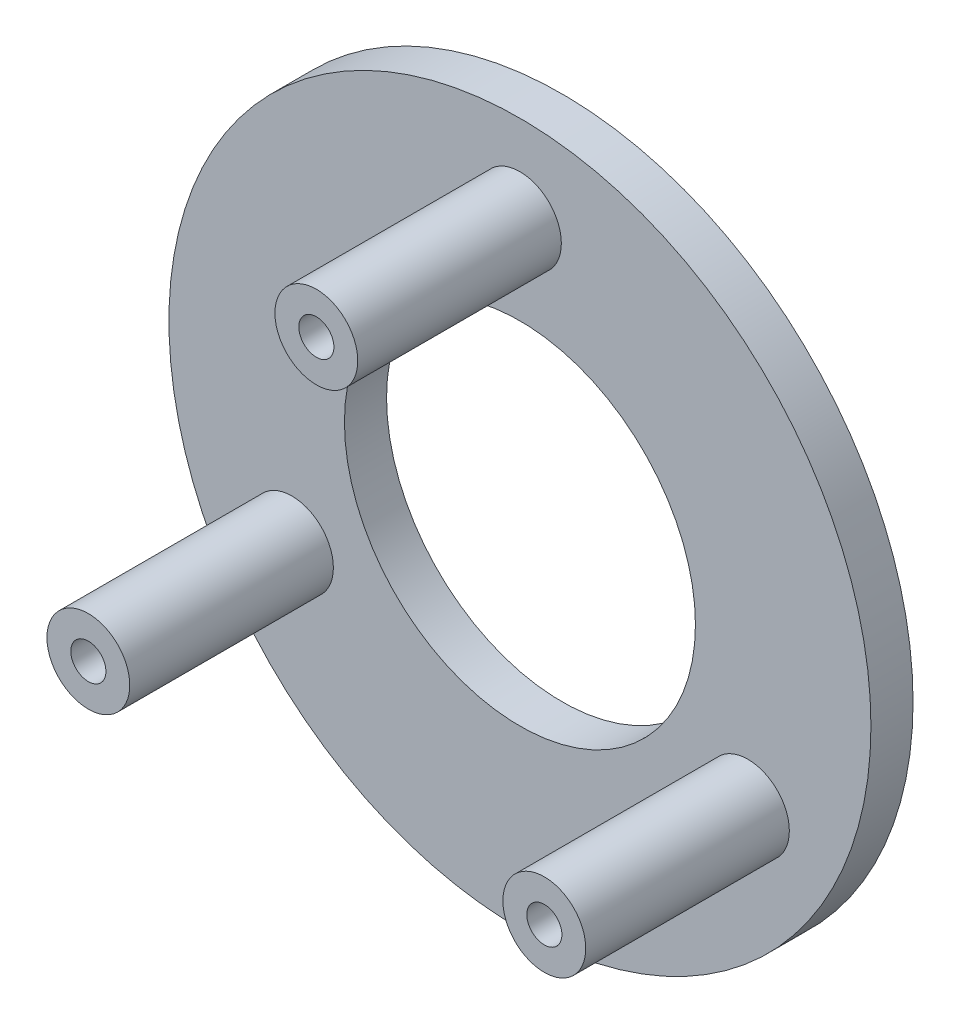
ISO-10303-21;
HEADER;
FILE_DESCRIPTION(('STEP AP214'),'2;1');
FILE_NAME('part.step','',(''),(''),'','','');
FILE_SCHEMA(('AUTOMOTIVE_DESIGN { 1 0 10303 214 1 1 1 1 }'));
ENDSEC;
DATA;
#1=APPLICATION_CONTEXT('core data for automotive mechanical design processes');
#2=APPLICATION_PROTOCOL_DEFINITION('international standard','automotive_design',2000,#1);
#3=PRODUCT_CONTEXT('',#1,'mechanical');
#4=PRODUCT('Part','Part','',(#3));
#5=PRODUCT_RELATED_PRODUCT_CATEGORY('part','',(#4));
#6=PRODUCT_DEFINITION_FORMATION('','',#4);
#7=PRODUCT_DEFINITION_CONTEXT('part definition',#1,'design');
#8=PRODUCT_DEFINITION('design','',#6,#7);
#9=PRODUCT_DEFINITION_SHAPE('','',#8);
#10=(LENGTH_UNIT() NAMED_UNIT(*) SI_UNIT(.MILLI.,.METRE.));
#11=(NAMED_UNIT(*) PLANE_ANGLE_UNIT() SI_UNIT($,.RADIAN.));
#12=(NAMED_UNIT(*) SI_UNIT($,.STERADIAN.) SOLID_ANGLE_UNIT());
#13=UNCERTAINTY_MEASURE_WITH_UNIT(LENGTH_MEASURE(1.E-05),#10,'distance_accuracy_value','');
#14=(GEOMETRIC_REPRESENTATION_CONTEXT(3) GLOBAL_UNCERTAINTY_ASSIGNED_CONTEXT((#13)) GLOBAL_UNIT_ASSIGNED_CONTEXT((#10,
#11,#12)) REPRESENTATION_CONTEXT('',''));
#15=CARTESIAN_POINT('',(0.,0.,0.));
#16=DIRECTION('',(0.,0.,1.));
#17=DIRECTION('',(1.,0.,0.));
#18=AXIS2_PLACEMENT_3D('',#15,#16,#17);
#19=CARTESIAN_POINT('',(0.,0.,3.));
#20=DIRECTION('',(0.,0.,1.));
#21=DIRECTION('',(1.,0.,0.));
#22=AXIS2_PLACEMENT_3D('',#19,#20,#21);
#23=PLANE('',#22);
#24=CARTESIAN_POINT('',(16.2379763209582,-9.37499999999999,3.));
#25=DIRECTION('',(0.,0.,1.));
#26=DIRECTION('',(1.,0.,0.));
#27=AXIS2_PLACEMENT_3D('',#24,#25,#26);
#28=CIRCLE('',#27,2.95);
#29=CARTESIAN_POINT('',(19.1879763209582,-9.37499999999999,3.));
#30=VERTEX_POINT('',#29);
#31=EDGE_CURVE('E63',#30,#30,#28,.T.);
#32=ORIENTED_EDGE('',*,*,#31,.F.);
#33=EDGE_LOOP('',(#32));
#34=FACE_BOUND('',#33,.T.);
#35=CARTESIAN_POINT('',(0.,0.,3.));
#36=DIRECTION('',(0.,0.,1.));
#37=DIRECTION('',(1.,0.,0.));
#38=AXIS2_PLACEMENT_3D('',#35,#36,#37);
#39=CIRCLE('',#38,12.5);
#40=CARTESIAN_POINT('',(12.5,0.,3.));
#41=VERTEX_POINT('',#40);
#42=EDGE_CURVE('E50',#41,#41,#39,.T.);
#43=ORIENTED_EDGE('',*,*,#42,.F.);
#44=EDGE_LOOP('',(#43));
#45=FACE_BOUND('',#44,.T.);
#46=CARTESIAN_POINT('',(0.,0.,3.));
#47=DIRECTION('',(0.,0.,1.));
#48=DIRECTION('',(1.,0.,0.));
#49=AXIS2_PLACEMENT_3D('',#46,#47,#48);
#50=CIRCLE('',#49,25.);
#51=CARTESIAN_POINT('',(25.,0.,3.));
#52=VERTEX_POINT('',#51);
#53=EDGE_CURVE('E10',#52,#52,#50,.T.);
#54=ORIENTED_EDGE('',*,*,#53,.T.);
#55=EDGE_LOOP('',(#54));
#56=FACE_BOUND('',#55,.T.);
#57=CARTESIAN_POINT('',(0.,18.75,3.));
#58=DIRECTION('',(0.,0.,1.));
#59=DIRECTION('',(1.,0.,0.));
#60=AXIS2_PLACEMENT_3D('',#57,#58,#59);
#61=CIRCLE('',#60,2.95);
#62=CARTESIAN_POINT('',(2.95,18.75,3.));
#63=VERTEX_POINT('',#62);
#64=EDGE_CURVE('E56',#63,#63,#61,.T.);
#65=ORIENTED_EDGE('',*,*,#64,.F.);
#66=EDGE_LOOP('',(#65));
#67=FACE_BOUND('',#66,.T.);
#68=CARTESIAN_POINT('',(-16.2379763209582,-9.37500000000001,3.));
#69=DIRECTION('',(0.,0.,1.));
#70=DIRECTION('',(1.,0.,0.));
#71=AXIS2_PLACEMENT_3D('',#68,#69,#70);
#72=CIRCLE('',#71,2.95);
#73=CARTESIAN_POINT('',(-13.2879763209582,-9.37500000000001,3.));
#74=VERTEX_POINT('',#73);
#75=EDGE_CURVE('E67',#74,#74,#72,.T.);
#76=ORIENTED_EDGE('',*,*,#75,.F.);
#77=EDGE_LOOP('',(#76));
#78=FACE_BOUND('',#77,.T.);
#79=ADVANCED_FACE('F37',(#34,#45,#56,#67,#78),#23,.T.);
#80=CARTESIAN_POINT('',(0.,0.,0.));
#81=DIRECTION('',(0.,0.,1.));
#82=DIRECTION('',(1.,0.,0.));
#83=AXIS2_PLACEMENT_3D('',#80,#81,#82);
#84=PLANE('',#83);
#85=CARTESIAN_POINT('',(0.,0.,0.));
#86=DIRECTION('',(0.,0.,1.));
#87=DIRECTION('',(1.,0.,0.));
#88=AXIS2_PLACEMENT_3D('',#85,#86,#87);
#89=CIRCLE('',#88,25.);
#90=CARTESIAN_POINT('',(25.,0.,0.));
#91=VERTEX_POINT('',#90);
#92=EDGE_CURVE('E41',#91,#91,#89,.T.);
#93=ORIENTED_EDGE('',*,*,#92,.F.);
#94=EDGE_LOOP('',(#93));
#95=FACE_BOUND('',#94,.T.);
#96=CARTESIAN_POINT('',(0.,0.,0.));
#97=DIRECTION('',(0.,0.,1.));
#98=DIRECTION('',(1.,0.,0.));
#99=AXIS2_PLACEMENT_3D('',#96,#97,#98);
#100=CIRCLE('',#99,12.5);
#101=CARTESIAN_POINT('',(12.5,0.,0.));
#102=VERTEX_POINT('',#101);
#103=EDGE_CURVE('E52',#102,#102,#100,.T.);
#104=ORIENTED_EDGE('',*,*,#103,.T.);
#105=EDGE_LOOP('',(#104));
#106=FACE_BOUND('',#105,.T.);
#107=ADVANCED_FACE('F134',(#95,#106),#84,.F.);
#108=CARTESIAN_POINT('',(0.,0.,3.));
#109=DIRECTION('',(0.,0.,-1.));
#110=DIRECTION('',(-1.,0.,0.));
#111=AXIS2_PLACEMENT_3D('',#108,#109,#110);
#112=CYLINDRICAL_SURFACE('',#111,25.);
#113=ORIENTED_EDGE('',*,*,#53,.F.);
#114=EDGE_LOOP('',(#113));
#115=FACE_BOUND('',#114,.T.);
#116=ORIENTED_EDGE('',*,*,#92,.T.);
#117=EDGE_LOOP('',(#116));
#118=FACE_BOUND('',#117,.T.);
#119=ADVANCED_FACE('F39',(#115,#118),#112,.T.);
#120=CARTESIAN_POINT('',(0.,0.,3.));
#121=DIRECTION('',(0.,0.,-1.));
#122=DIRECTION('',(-1.,0.,0.));
#123=AXIS2_PLACEMENT_3D('',#120,#121,#122);
#124=CYLINDRICAL_SURFACE('',#123,12.5);
#125=ORIENTED_EDGE('',*,*,#42,.T.);
#126=EDGE_LOOP('',(#125));
#127=FACE_BOUND('',#126,.T.);
#128=ORIENTED_EDGE('',*,*,#103,.F.);
#129=EDGE_LOOP('',(#128));
#130=FACE_BOUND('',#129,.T.);
#131=ADVANCED_FACE('F144',(#127,#130),#124,.F.);
#132=CARTESIAN_POINT('',(-16.2379763209582,-9.37500000000001,17.5));
#133=DIRECTION('',(0.,0.,-1.));
#134=DIRECTION('',(-1.,0.,0.));
#135=AXIS2_PLACEMENT_3D('',#132,#133,#134);
#136=CYLINDRICAL_SURFACE('',#135,2.95);
#137=ORIENTED_EDGE('',*,*,#75,.T.);
#138=EDGE_LOOP('',(#137));
#139=FACE_BOUND('',#138,.T.);
#140=CARTESIAN_POINT('',(-16.2379763209582,-9.37500000000001,17.5));
#141=DIRECTION('',(0.,0.,-1.));
#142=DIRECTION('',(-1.,0.,0.));
#143=AXIS2_PLACEMENT_3D('',#140,#141,#142);
#144=CIRCLE('',#143,2.95);
#145=CARTESIAN_POINT('',(-19.1879763209582,-9.37500000000001,17.5));
#146=VERTEX_POINT('',#145);
#147=EDGE_CURVE('E71',#146,#146,#144,.T.);
#148=ORIENTED_EDGE('',*,*,#147,.T.);
#149=EDGE_LOOP('',(#148));
#150=FACE_BOUND('',#149,.T.);
#151=ADVANCED_FACE('F147',(#139,#150),#136,.T.);
#152=CARTESIAN_POINT('',(-16.2379763209582,-9.37500000000001,17.5));
#153=DIRECTION('',(0.,0.,-1.));
#154=DIRECTION('',(-1.,0.,0.));
#155=AXIS2_PLACEMENT_3D('',#152,#153,#154);
#156=PLANE('',#155);
#157=CARTESIAN_POINT('',(-16.2379763209582,-9.37500000000001,17.5));
#158=DIRECTION('',(0.,0.,1.));
#159=DIRECTION('',(1.,0.,0.));
#160=AXIS2_PLACEMENT_3D('',#157,#158,#159);
#161=CIRCLE('',#160,1.25);
#162=CARTESIAN_POINT('',(-14.9879763209582,-9.37500000000001,17.5));
#163=VERTEX_POINT('',#162);
#164=EDGE_CURVE('E92',#163,#163,#161,.T.);
#165=ORIENTED_EDGE('',*,*,#164,.F.);
#166=EDGE_LOOP('',(#165));
#167=FACE_BOUND('',#166,.T.);
#168=ORIENTED_EDGE('',*,*,#147,.F.);
#169=EDGE_LOOP('',(#168));
#170=FACE_BOUND('',#169,.T.);
#171=ADVANCED_FACE('F151',(#167,#170),#156,.F.);
#172=CARTESIAN_POINT('',(0.,18.75,17.5));
#173=DIRECTION('',(0.,0.,-1.));
#174=DIRECTION('',(-1.,0.,0.));
#175=AXIS2_PLACEMENT_3D('',#172,#173,#174);
#176=CYLINDRICAL_SURFACE('',#175,2.95);
#177=ORIENTED_EDGE('',*,*,#64,.T.);
#178=EDGE_LOOP('',(#177));
#179=FACE_BOUND('',#178,.T.);
#180=CARTESIAN_POINT('',(0.,18.75,17.5));
#181=DIRECTION('',(0.,0.,-1.));
#182=DIRECTION('',(-1.,0.,0.));
#183=AXIS2_PLACEMENT_3D('',#180,#181,#182);
#184=CIRCLE('',#183,2.95);
#185=CARTESIAN_POINT('',(-2.95,18.75,17.5));
#186=VERTEX_POINT('',#185);
#187=EDGE_CURVE('E75',#186,#186,#184,.T.);
#188=ORIENTED_EDGE('',*,*,#187,.T.);
#189=EDGE_LOOP('',(#188));
#190=FACE_BOUND('',#189,.T.);
#191=ADVANCED_FACE('F130',(#179,#190),#176,.T.);
#192=CARTESIAN_POINT('',(0.,18.75,17.5));
#193=DIRECTION('',(0.,0.,-1.));
#194=DIRECTION('',(-1.,0.,0.));
#195=AXIS2_PLACEMENT_3D('',#192,#193,#194);
#196=PLANE('',#195);
#197=CARTESIAN_POINT('',(0.,18.75,17.5));
#198=DIRECTION('',(0.,0.,1.));
#199=DIRECTION('',(1.,0.,0.));
#200=AXIS2_PLACEMENT_3D('',#197,#198,#199);
#201=CIRCLE('',#200,1.25);
#202=CARTESIAN_POINT('',(1.25,18.75,17.5));
#203=VERTEX_POINT('',#202);
#204=EDGE_CURVE('E84',#203,#203,#201,.T.);
#205=ORIENTED_EDGE('',*,*,#204,.F.);
#206=EDGE_LOOP('',(#205));
#207=FACE_BOUND('',#206,.T.);
#208=ORIENTED_EDGE('',*,*,#187,.F.);
#209=EDGE_LOOP('',(#208));
#210=FACE_BOUND('',#209,.T.);
#211=ADVANCED_FACE('F124',(#207,#210),#196,.F.);
#212=CARTESIAN_POINT('',(16.2379763209582,-9.37499999999999,17.5));
#213=DIRECTION('',(0.,0.,-1.));
#214=DIRECTION('',(-1.,0.,0.));
#215=AXIS2_PLACEMENT_3D('',#212,#213,#214);
#216=CYLINDRICAL_SURFACE('',#215,2.95);
#217=ORIENTED_EDGE('',*,*,#31,.T.);
#218=EDGE_LOOP('',(#217));
#219=FACE_BOUND('',#218,.T.);
#220=CARTESIAN_POINT('',(16.2379763209582,-9.37499999999999,17.5));
#221=DIRECTION('',(0.,0.,-1.));
#222=DIRECTION('',(-1.,0.,0.));
#223=AXIS2_PLACEMENT_3D('',#220,#221,#222);
#224=CIRCLE('',#223,2.95);
#225=CARTESIAN_POINT('',(13.2879763209582,-9.37499999999999,17.5));
#226=VERTEX_POINT('',#225);
#227=EDGE_CURVE('E79',#226,#226,#224,.T.);
#228=ORIENTED_EDGE('',*,*,#227,.T.);
#229=EDGE_LOOP('',(#228));
#230=FACE_BOUND('',#229,.T.);
#231=ADVANCED_FACE('F119',(#219,#230),#216,.T.);
#232=CARTESIAN_POINT('',(16.2379763209582,-9.37499999999999,17.5));
#233=DIRECTION('',(0.,0.,-1.));
#234=DIRECTION('',(-1.,0.,0.));
#235=AXIS2_PLACEMENT_3D('',#232,#233,#234);
#236=PLANE('',#235);
#237=CARTESIAN_POINT('',(16.2379763209582,-9.37499999999999,17.5));
#238=DIRECTION('',(0.,0.,1.));
#239=DIRECTION('',(1.,0.,0.));
#240=AXIS2_PLACEMENT_3D('',#237,#238,#239);
#241=CIRCLE('',#240,1.25);
#242=CARTESIAN_POINT('',(17.4879763209582,-9.37499999999999,17.5));
#243=VERTEX_POINT('',#242);
#244=EDGE_CURVE('E100',#243,#243,#241,.T.);
#245=ORIENTED_EDGE('',*,*,#244,.F.);
#246=EDGE_LOOP('',(#245));
#247=FACE_BOUND('',#246,.T.);
#248=ORIENTED_EDGE('',*,*,#227,.F.);
#249=EDGE_LOOP('',(#248));
#250=FACE_BOUND('',#249,.T.);
#251=ADVANCED_FACE('F113',(#247,#250),#236,.F.);
#252=CARTESIAN_POINT('',(16.2379763209582,-9.37499999999999,9.5));
#253=DIRECTION('',(0.,0.,1.));
#254=DIRECTION('',(1.,0.,0.));
#255=AXIS2_PLACEMENT_3D('',#252,#253,#254);
#256=CYLINDRICAL_SURFACE('',#255,1.25);
#257=CARTESIAN_POINT('',(16.2379763209582,-9.37499999999999,9.5));
#258=DIRECTION('',(0.,0.,1.));
#259=DIRECTION('',(1.,0.,0.));
#260=AXIS2_PLACEMENT_3D('',#257,#258,#259);
#261=CIRCLE('',#260,1.25);
#262=CARTESIAN_POINT('',(17.4879763209582,-9.37499999999999,9.5));
#263=VERTEX_POINT('',#262);
#264=EDGE_CURVE('E83',#263,#263,#261,.T.);
#265=ORIENTED_EDGE('',*,*,#264,.F.);
#266=EDGE_LOOP('',(#265));
#267=FACE_BOUND('',#266,.T.);
#268=ORIENTED_EDGE('',*,*,#244,.T.);
#269=EDGE_LOOP('',(#268));
#270=FACE_BOUND('',#269,.T.);
#271=ADVANCED_FACE('F110',(#267,#270),#256,.F.);
#272=CARTESIAN_POINT('',(16.2379763209582,-9.37499999999999,9.5));
#273=DIRECTION('',(0.,0.,1.));
#274=DIRECTION('',(1.,0.,0.));
#275=AXIS2_PLACEMENT_3D('',#272,#273,#274);
#276=PLANE('',#275);
#277=ORIENTED_EDGE('',*,*,#264,.T.);
#278=EDGE_LOOP('',(#277));
#279=FACE_BOUND('',#278,.T.);
#280=ADVANCED_FACE('F108',(#279),#276,.T.);
#281=CARTESIAN_POINT('',(0.,18.75,9.5));
#282=DIRECTION('',(0.,0.,1.));
#283=DIRECTION('',(1.,0.,0.));
#284=AXIS2_PLACEMENT_3D('',#281,#282,#283);
#285=CYLINDRICAL_SURFACE('',#284,1.25);
#286=CARTESIAN_POINT('',(0.,18.75,9.5));
#287=DIRECTION('',(0.,0.,1.));
#288=DIRECTION('',(1.,0.,0.));
#289=AXIS2_PLACEMENT_3D('',#286,#287,#288);
#290=CIRCLE('',#289,1.25);
#291=CARTESIAN_POINT('',(1.25,18.75,9.5));
#292=VERTEX_POINT('',#291);
#293=EDGE_CURVE('E88',#292,#292,#290,.T.);
#294=ORIENTED_EDGE('',*,*,#293,.F.);
#295=EDGE_LOOP('',(#294));
#296=FACE_BOUND('',#295,.T.);
#297=ORIENTED_EDGE('',*,*,#204,.T.);
#298=EDGE_LOOP('',(#297));
#299=FACE_BOUND('',#298,.T.);
#300=ADVANCED_FACE('F201',(#296,#299),#285,.F.);
#301=CARTESIAN_POINT('',(0.,18.75,9.5));
#302=DIRECTION('',(0.,0.,1.));
#303=DIRECTION('',(1.,0.,0.));
#304=AXIS2_PLACEMENT_3D('',#301,#302,#303);
#305=PLANE('',#304);
#306=ORIENTED_EDGE('',*,*,#293,.T.);
#307=EDGE_LOOP('',(#306));
#308=FACE_BOUND('',#307,.T.);
#309=ADVANCED_FACE('F210',(#308),#305,.T.);
#310=CARTESIAN_POINT('',(-16.2379763209582,-9.37500000000001,9.5));
#311=DIRECTION('',(0.,0.,1.));
#312=DIRECTION('',(1.,0.,0.));
#313=AXIS2_PLACEMENT_3D('',#310,#311,#312);
#314=CYLINDRICAL_SURFACE('',#313,1.25);
#315=CARTESIAN_POINT('',(-16.2379763209582,-9.37500000000001,9.5));
#316=DIRECTION('',(0.,0.,1.));
#317=DIRECTION('',(1.,0.,0.));
#318=AXIS2_PLACEMENT_3D('',#315,#316,#317);
#319=CIRCLE('',#318,1.25);
#320=CARTESIAN_POINT('',(-14.9879763209582,-9.37500000000001,9.5));
#321=VERTEX_POINT('',#320);
#322=EDGE_CURVE('E96',#321,#321,#319,.T.);
#323=ORIENTED_EDGE('',*,*,#322,.F.);
#324=EDGE_LOOP('',(#323));
#325=FACE_BOUND('',#324,.T.);
#326=ORIENTED_EDGE('',*,*,#164,.T.);
#327=EDGE_LOOP('',(#326));
#328=FACE_BOUND('',#327,.T.);
#329=ADVANCED_FACE('F220',(#325,#328),#314,.F.);
#330=CARTESIAN_POINT('',(-16.2379763209582,-9.37500000000001,9.5));
#331=DIRECTION('',(0.,0.,1.));
#332=DIRECTION('',(1.,0.,0.));
#333=AXIS2_PLACEMENT_3D('',#330,#331,#332);
#334=PLANE('',#333);
#335=ORIENTED_EDGE('',*,*,#322,.T.);
#336=EDGE_LOOP('',(#335));
#337=FACE_BOUND('',#336,.T.);
#338=ADVANCED_FACE('F230',(#337),#334,.T.);
#339=CLOSED_SHELL('',(#79,#107,#119,#131,#151,#171,#191,#211,#231,#251,#271,#280,#300,#309,#329,#338));
#340=MANIFOLD_SOLID_BREP('B2',#339);
#341=ADVANCED_BREP_SHAPE_REPRESENTATION('',(#18,#340),#14);
#342=SHAPE_DEFINITION_REPRESENTATION(#9,#341);
ENDSEC;
END-ISO-10303-21;
